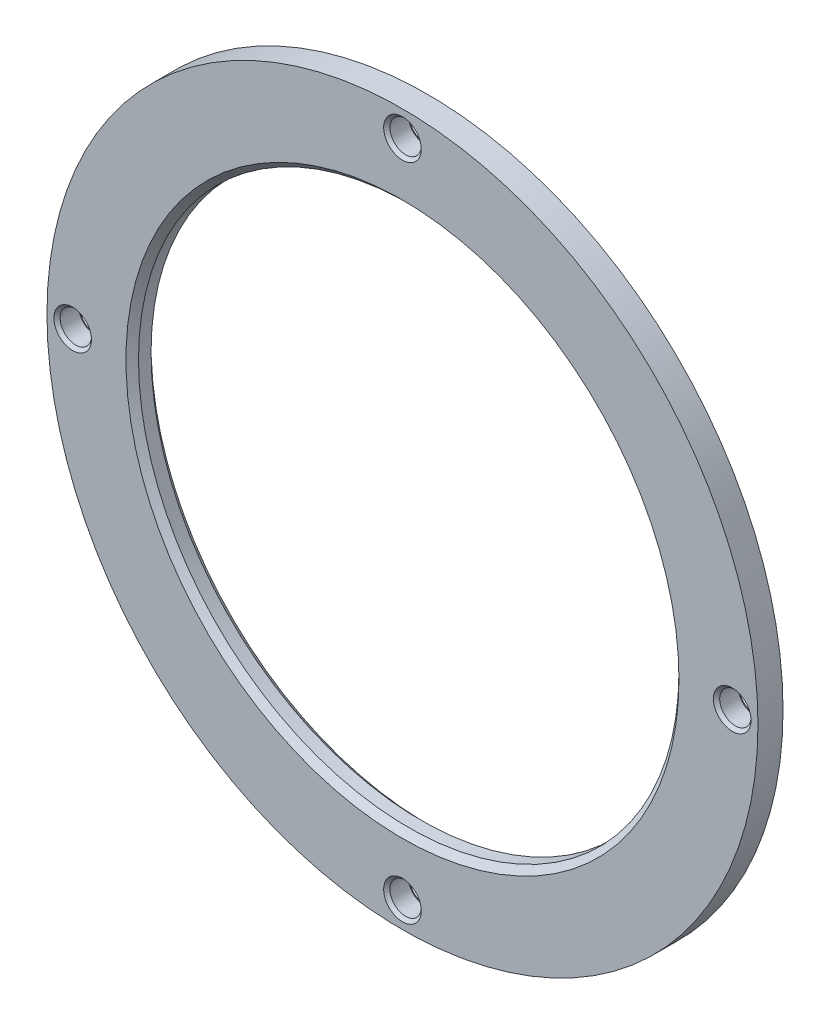
ISO-10303-21;
HEADER;
FILE_DESCRIPTION(('STEP AP214'),'2;1');
FILE_NAME('part.step','',(''),(''),'','','');
FILE_SCHEMA(('AUTOMOTIVE_DESIGN { 1 0 10303 214 1 1 1 1 }'));
ENDSEC;
DATA;
#1=APPLICATION_CONTEXT('core data for automotive mechanical design processes');
#2=APPLICATION_PROTOCOL_DEFINITION('international standard','automotive_design',2000,#1);
#3=PRODUCT_CONTEXT('',#1,'mechanical');
#4=PRODUCT('Part','Part','',(#3));
#5=PRODUCT_RELATED_PRODUCT_CATEGORY('part','',(#4));
#6=PRODUCT_DEFINITION_FORMATION('','',#4);
#7=PRODUCT_DEFINITION_CONTEXT('part definition',#1,'design');
#8=PRODUCT_DEFINITION('design','',#6,#7);
#9=PRODUCT_DEFINITION_SHAPE('','',#8);
#10=(LENGTH_UNIT() NAMED_UNIT(*) SI_UNIT(.MILLI.,.METRE.));
#11=(NAMED_UNIT(*) PLANE_ANGLE_UNIT() SI_UNIT($,.RADIAN.));
#12=(NAMED_UNIT(*) SI_UNIT($,.STERADIAN.) SOLID_ANGLE_UNIT());
#13=UNCERTAINTY_MEASURE_WITH_UNIT(LENGTH_MEASURE(1.E-05),#10,'distance_accuracy_value','');
#14=(GEOMETRIC_REPRESENTATION_CONTEXT(3) GLOBAL_UNCERTAINTY_ASSIGNED_CONTEXT((#13)) GLOBAL_UNIT_ASSIGNED_CONTEXT((#10,
#11,#12)) REPRESENTATION_CONTEXT('',''));
#15=CARTESIAN_POINT('',(0.,0.,0.));
#16=DIRECTION('',(0.,0.,1.));
#17=DIRECTION('',(1.,0.,0.));
#18=AXIS2_PLACEMENT_3D('',#15,#16,#17);
#19=CARTESIAN_POINT('',(0.,0.,2.));
#20=DIRECTION('',(0.,0.,1.));
#21=DIRECTION('',(1.,0.,0.));
#22=AXIS2_PLACEMENT_3D('',#19,#20,#21);
#23=PLANE('',#22);
#24=CARTESIAN_POINT('',(-2.75477877634723E-13,-26.3,2.));
#25=DIRECTION('',(0.,0.,1.));
#26=DIRECTION('',(1.,0.,0.));
#27=AXIS2_PLACEMENT_3D('',#24,#25,#26);
#28=CIRCLE('',#27,1.49999999999999);
#29=CARTESIAN_POINT('',(1.49999999999972,-26.3,2.));
#30=VERTEX_POINT('',#29);
#31=EDGE_CURVE('E11',#30,#30,#28,.F.);
#32=ORIENTED_EDGE('',*,*,#31,.T.);
#33=EDGE_LOOP('',(#32));
#34=FACE_BOUND('',#33,.T.);
#35=CARTESIAN_POINT('',(26.3,0.,2.));
#36=DIRECTION('',(0.,0.,1.));
#37=DIRECTION('',(1.,0.,0.));
#38=AXIS2_PLACEMENT_3D('',#35,#36,#37);
#39=CIRCLE('',#38,1.49999999999999);
#40=CARTESIAN_POINT('',(27.8,0.,2.));
#41=VERTEX_POINT('',#40);
#42=EDGE_CURVE('E59',#41,#41,#39,.F.);
#43=ORIENTED_EDGE('',*,*,#42,.T.);
#44=EDGE_LOOP('',(#43));
#45=FACE_BOUND('',#44,.T.);
#46=CARTESIAN_POINT('',(0.,26.3,2.));
#47=DIRECTION('',(0.,0.,1.));
#48=DIRECTION('',(1.,0.,0.));
#49=AXIS2_PLACEMENT_3D('',#46,#47,#48);
#50=CIRCLE('',#49,1.49999999999999);
#51=CARTESIAN_POINT('',(1.50000000000009,26.3,2.));
#52=VERTEX_POINT('',#51);
#53=EDGE_CURVE('E63',#52,#52,#50,.F.);
#54=ORIENTED_EDGE('',*,*,#53,.T.);
#55=EDGE_LOOP('',(#54));
#56=FACE_BOUND('',#55,.T.);
#57=CARTESIAN_POINT('',(-26.3,0.,2.));
#58=DIRECTION('',(0.,0.,1.));
#59=DIRECTION('',(1.,0.,0.));
#60=AXIS2_PLACEMENT_3D('',#57,#58,#59);
#61=CIRCLE('',#60,1.49999999999999);
#62=CARTESIAN_POINT('',(-24.8,0.,2.));
#63=VERTEX_POINT('',#62);
#64=EDGE_CURVE('E67',#63,#63,#61,.F.);
#65=ORIENTED_EDGE('',*,*,#64,.T.);
#66=EDGE_LOOP('',(#65));
#67=FACE_BOUND('',#66,.T.);
#68=CARTESIAN_POINT('',(0.,0.,2.));
#69=DIRECTION('',(0.,0.,1.));
#70=DIRECTION('',(1.,0.,0.));
#71=AXIS2_PLACEMENT_3D('',#68,#69,#70);
#72=CIRCLE('',#71,22.05);
#73=CARTESIAN_POINT('',(22.05,0.,2.));
#74=VERTEX_POINT('',#73);
#75=EDGE_CURVE('E111',#74,#74,#72,.F.);
#76=ORIENTED_EDGE('',*,*,#75,.T.);
#77=EDGE_LOOP('',(#76));
#78=FACE_BOUND('',#77,.T.);
#79=CARTESIAN_POINT('',(0.,0.,2.));
#80=DIRECTION('',(0.,0.,1.));
#81=DIRECTION('',(1.,0.,0.));
#82=AXIS2_PLACEMENT_3D('',#79,#80,#81);
#83=CIRCLE('',#82,28.35);
#84=CARTESIAN_POINT('',(28.35,0.,2.));
#85=VERTEX_POINT('',#84);
#86=EDGE_CURVE('E120',#85,#85,#83,.T.);
#87=ORIENTED_EDGE('',*,*,#86,.T.);
#88=EDGE_LOOP('',(#87));
#89=FACE_BOUND('',#88,.T.);
#90=ADVANCED_FACE('F51',(#34,#45,#56,#67,#78,#89),#23,.T.);
#91=CARTESIAN_POINT('',(0.,0.,0.));
#92=DIRECTION('',(0.,0.,1.));
#93=DIRECTION('',(1.,0.,0.));
#94=AXIS2_PLACEMENT_3D('',#91,#92,#93);
#95=PLANE('',#94);
#96=CARTESIAN_POINT('',(-26.3,0.,0.));
#97=DIRECTION('',(0.,0.,1.));
#98=DIRECTION('',(1.,0.,0.));
#99=AXIS2_PLACEMENT_3D('',#96,#97,#98);
#100=CIRCLE('',#99,1.49999999999999);
#101=CARTESIAN_POINT('',(-24.8,0.,0.));
#102=VERTEX_POINT('',#101);
#103=EDGE_CURVE('E96',#102,#102,#100,.T.);
#104=ORIENTED_EDGE('',*,*,#103,.T.);
#105=EDGE_LOOP('',(#104));
#106=FACE_BOUND('',#105,.T.);
#107=CARTESIAN_POINT('',(0.,26.3,0.));
#108=DIRECTION('',(0.,0.,1.));
#109=DIRECTION('',(1.,0.,0.));
#110=AXIS2_PLACEMENT_3D('',#107,#108,#109);
#111=CIRCLE('',#110,1.49999999999999);
#112=CARTESIAN_POINT('',(1.50000000000009,26.3,0.));
#113=VERTEX_POINT('',#112);
#114=EDGE_CURVE('E99',#113,#113,#111,.T.);
#115=ORIENTED_EDGE('',*,*,#114,.T.);
#116=EDGE_LOOP('',(#115));
#117=FACE_BOUND('',#116,.T.);
#118=CARTESIAN_POINT('',(26.3,0.,0.));
#119=DIRECTION('',(0.,0.,1.));
#120=DIRECTION('',(1.,0.,0.));
#121=AXIS2_PLACEMENT_3D('',#118,#119,#120);
#122=CIRCLE('',#121,1.49999999999999);
#123=CARTESIAN_POINT('',(27.8,0.,0.));
#124=VERTEX_POINT('',#123);
#125=EDGE_CURVE('E102',#124,#124,#122,.T.);
#126=ORIENTED_EDGE('',*,*,#125,.T.);
#127=EDGE_LOOP('',(#126));
#128=FACE_BOUND('',#127,.T.);
#129=CARTESIAN_POINT('',(-2.75477877634723E-13,-26.3,0.));
#130=DIRECTION('',(0.,0.,1.));
#131=DIRECTION('',(1.,0.,0.));
#132=AXIS2_PLACEMENT_3D('',#129,#130,#131);
#133=CIRCLE('',#132,1.49999999999999);
#134=CARTESIAN_POINT('',(1.49999999999972,-26.3,0.));
#135=VERTEX_POINT('',#134);
#136=EDGE_CURVE('E105',#135,#135,#133,.T.);
#137=ORIENTED_EDGE('',*,*,#136,.T.);
#138=EDGE_LOOP('',(#137));
#139=FACE_BOUND('',#138,.T.);
#140=CARTESIAN_POINT('',(0.,0.,0.));
#141=DIRECTION('',(0.,0.,1.));
#142=DIRECTION('',(1.,0.,0.));
#143=AXIS2_PLACEMENT_3D('',#140,#141,#142);
#144=CIRCLE('',#143,22.05);
#145=CARTESIAN_POINT('',(22.05,0.,0.));
#146=VERTEX_POINT('',#145);
#147=EDGE_CURVE('E108',#146,#146,#144,.T.);
#148=ORIENTED_EDGE('',*,*,#147,.T.);
#149=EDGE_LOOP('',(#148));
#150=FACE_BOUND('',#149,.T.);
#151=CARTESIAN_POINT('',(0.,0.,0.));
#152=DIRECTION('',(0.,0.,1.));
#153=DIRECTION('',(1.,0.,0.));
#154=AXIS2_PLACEMENT_3D('',#151,#152,#153);
#155=CIRCLE('',#154,28.35);
#156=CARTESIAN_POINT('',(28.35,0.,0.));
#157=VERTEX_POINT('',#156);
#158=EDGE_CURVE('E121',#157,#157,#155,.T.);
#159=ORIENTED_EDGE('',*,*,#158,.F.);
#160=EDGE_LOOP('',(#159));
#161=FACE_BOUND('',#160,.T.);
#162=ADVANCED_FACE('F132',(#106,#117,#128,#139,#150,#161),#95,.F.);
#163=CARTESIAN_POINT('',(0.,0.,2.));
#164=DIRECTION('',(0.,0.,-1.));
#165=DIRECTION('',(-1.,0.,0.));
#166=AXIS2_PLACEMENT_3D('',#163,#164,#165);
#167=CYLINDRICAL_SURFACE('',#166,28.35);
#168=ORIENTED_EDGE('',*,*,#86,.F.);
#169=EDGE_LOOP('',(#168));
#170=FACE_BOUND('',#169,.T.);
#171=ORIENTED_EDGE('',*,*,#158,.T.);
#172=EDGE_LOOP('',(#171));
#173=FACE_BOUND('',#172,.T.);
#174=ADVANCED_FACE('F128',(#170,#173),#167,.T.);
#175=CARTESIAN_POINT('',(0.,0.,2.));
#176=DIRECTION('',(0.,0.,-1.));
#177=DIRECTION('',(-1.,0.,0.));
#178=AXIS2_PLACEMENT_3D('',#175,#176,#177);
#179=CYLINDRICAL_SURFACE('',#178,21.55);
#180=CARTESIAN_POINT('',(0.,0.,1.5));
#181=DIRECTION('',(0.,0.,1.));
#182=DIRECTION('',(1.,0.,0.));
#183=AXIS2_PLACEMENT_3D('',#180,#181,#182);
#184=CIRCLE('',#183,21.55);
#185=CARTESIAN_POINT('',(21.55,0.,1.5));
#186=VERTEX_POINT('',#185);
#187=EDGE_CURVE('E114',#186,#186,#184,.T.);
#188=ORIENTED_EDGE('',*,*,#187,.T.);
#189=EDGE_LOOP('',(#188));
#190=FACE_BOUND('',#189,.T.);
#191=CARTESIAN_POINT('',(0.,0.,0.500000000000014));
#192=DIRECTION('',(0.,0.,1.));
#193=DIRECTION('',(1.,0.,0.));
#194=AXIS2_PLACEMENT_3D('',#191,#192,#193);
#195=CIRCLE('',#194,21.55);
#196=CARTESIAN_POINT('',(21.55,0.,0.500000000000014));
#197=VERTEX_POINT('',#196);
#198=EDGE_CURVE('E117',#197,#197,#195,.F.);
#199=ORIENTED_EDGE('',*,*,#198,.T.);
#200=EDGE_LOOP('',(#199));
#201=FACE_BOUND('',#200,.T.);
#202=ADVANCED_FACE('F131',(#190,#201),#179,.F.);
#203=CARTESIAN_POINT('',(0.,0.,1.5));
#204=DIRECTION('',(0.,0.,1.));
#205=DIRECTION('',(1.,0.,0.));
#206=AXIS2_PLACEMENT_3D('',#203,#204,#205);
#207=CONICAL_SURFACE('',#206,21.55,0.785398163397459);
#208=ORIENTED_EDGE('',*,*,#75,.F.);
#209=EDGE_LOOP('',(#208));
#210=FACE_BOUND('',#209,.T.);
#211=ORIENTED_EDGE('',*,*,#187,.F.);
#212=EDGE_LOOP('',(#211));
#213=FACE_BOUND('',#212,.T.);
#214=ADVANCED_FACE('F148',(#210,#213),#207,.F.);
#215=CARTESIAN_POINT('',(0.,0.,0.));
#216=DIRECTION('',(0.,0.,-1.));
#217=DIRECTION('',(-1.,0.,0.));
#218=AXIS2_PLACEMENT_3D('',#215,#216,#217);
#219=CONICAL_SURFACE('',#218,22.05,0.785398163397435);
#220=ORIENTED_EDGE('',*,*,#198,.F.);
#221=EDGE_LOOP('',(#220));
#222=FACE_BOUND('',#221,.T.);
#223=ORIENTED_EDGE('',*,*,#147,.F.);
#224=EDGE_LOOP('',(#223));
#225=FACE_BOUND('',#224,.T.);
#226=ADVANCED_FACE('F154',(#222,#225),#219,.F.);
#227=CARTESIAN_POINT('',(-26.3,0.,2.));
#228=DIRECTION('',(0.,0.,-1.));
#229=DIRECTION('',(-1.,0.,0.));
#230=AXIS2_PLACEMENT_3D('',#227,#228,#229);
#231=CYLINDRICAL_SURFACE('',#230,1.25);
#232=CARTESIAN_POINT('',(-26.3,0.,0.249999999999997));
#233=DIRECTION('',(0.,0.,1.));
#234=DIRECTION('',(1.,0.,0.));
#235=AXIS2_PLACEMENT_3D('',#232,#233,#234);
#236=CIRCLE('',#235,1.25);
#237=CARTESIAN_POINT('',(-25.05,0.,0.249999999999997));
#238=VERTEX_POINT('',#237);
#239=EDGE_CURVE('E90',#238,#238,#236,.F.);
#240=ORIENTED_EDGE('',*,*,#239,.T.);
#241=EDGE_LOOP('',(#240));
#242=FACE_BOUND('',#241,.T.);
#243=CARTESIAN_POINT('',(-26.3,0.,1.75));
#244=DIRECTION('',(0.,0.,1.));
#245=DIRECTION('',(1.,0.,0.));
#246=AXIS2_PLACEMENT_3D('',#243,#244,#245);
#247=CIRCLE('',#246,1.25);
#248=CARTESIAN_POINT('',(-25.05,0.,1.75));
#249=VERTEX_POINT('',#248);
#250=EDGE_CURVE('E93',#249,#249,#247,.T.);
#251=ORIENTED_EDGE('',*,*,#250,.T.);
#252=EDGE_LOOP('',(#251));
#253=FACE_BOUND('',#252,.T.);
#254=ADVANCED_FACE('F161',(#242,#253),#231,.F.);
#255=CARTESIAN_POINT('',(-2.75477877634723E-13,-26.3,2.));
#256=DIRECTION('',(0.,0.,-1.));
#257=DIRECTION('',(-1.,0.,0.));
#258=AXIS2_PLACEMENT_3D('',#255,#256,#257);
#259=CYLINDRICAL_SURFACE('',#258,1.25);
#260=CARTESIAN_POINT('',(-2.75477877634723E-13,-26.3,0.249999999999997));
#261=DIRECTION('',(0.,0.,1.));
#262=DIRECTION('',(1.,0.,0.));
#263=AXIS2_PLACEMENT_3D('',#260,#261,#262);
#264=CIRCLE('',#263,1.25);
#265=CARTESIAN_POINT('',(1.24999999999973,-26.3,0.249999999999997));
#266=VERTEX_POINT('',#265);
#267=EDGE_CURVE('E72',#266,#266,#264,.F.);
#268=ORIENTED_EDGE('',*,*,#267,.T.);
#269=EDGE_LOOP('',(#268));
#270=FACE_BOUND('',#269,.T.);
#271=CARTESIAN_POINT('',(-2.75477877634723E-13,-26.3,1.75));
#272=DIRECTION('',(0.,0.,1.));
#273=DIRECTION('',(1.,0.,0.));
#274=AXIS2_PLACEMENT_3D('',#271,#272,#273);
#275=CIRCLE('',#274,1.25);
#276=CARTESIAN_POINT('',(1.24999999999973,-26.3,1.75));
#277=VERTEX_POINT('',#276);
#278=EDGE_CURVE('E75',#277,#277,#275,.T.);
#279=ORIENTED_EDGE('',*,*,#278,.T.);
#280=EDGE_LOOP('',(#279));
#281=FACE_BOUND('',#280,.T.);
#282=ADVANCED_FACE('F225',(#270,#281),#259,.F.);
#283=CARTESIAN_POINT('',(26.3,0.,2.));
#284=DIRECTION('',(0.,0.,-1.));
#285=DIRECTION('',(-1.,0.,0.));
#286=AXIS2_PLACEMENT_3D('',#283,#284,#285);
#287=CYLINDRICAL_SURFACE('',#286,1.25);
#288=CARTESIAN_POINT('',(26.3,0.,0.249999999999997));
#289=DIRECTION('',(0.,0.,1.));
#290=DIRECTION('',(1.,0.,0.));
#291=AXIS2_PLACEMENT_3D('',#288,#289,#290);
#292=CIRCLE('',#291,1.25);
#293=CARTESIAN_POINT('',(27.55,0.,0.249999999999997));
#294=VERTEX_POINT('',#293);
#295=EDGE_CURVE('E78',#294,#294,#292,.F.);
#296=ORIENTED_EDGE('',*,*,#295,.T.);
#297=EDGE_LOOP('',(#296));
#298=FACE_BOUND('',#297,.T.);
#299=CARTESIAN_POINT('',(26.3,0.,1.75));
#300=DIRECTION('',(0.,0.,1.));
#301=DIRECTION('',(1.,0.,0.));
#302=AXIS2_PLACEMENT_3D('',#299,#300,#301);
#303=CIRCLE('',#302,1.25);
#304=CARTESIAN_POINT('',(27.55,0.,1.75));
#305=VERTEX_POINT('',#304);
#306=EDGE_CURVE('E81',#305,#305,#303,.T.);
#307=ORIENTED_EDGE('',*,*,#306,.T.);
#308=EDGE_LOOP('',(#307));
#309=FACE_BOUND('',#308,.T.);
#310=ADVANCED_FACE('F219',(#298,#309),#287,.F.);
#311=CARTESIAN_POINT('',(0.,26.3,2.));
#312=DIRECTION('',(0.,0.,-1.));
#313=DIRECTION('',(-1.,0.,0.));
#314=AXIS2_PLACEMENT_3D('',#311,#312,#313);
#315=CYLINDRICAL_SURFACE('',#314,1.25);
#316=CARTESIAN_POINT('',(0.,26.3,0.249999999999997));
#317=DIRECTION('',(0.,0.,1.));
#318=DIRECTION('',(1.,0.,0.));
#319=AXIS2_PLACEMENT_3D('',#316,#317,#318);
#320=CIRCLE('',#319,1.25);
#321=CARTESIAN_POINT('',(1.25000000000009,26.3,0.249999999999997));
#322=VERTEX_POINT('',#321);
#323=EDGE_CURVE('E84',#322,#322,#320,.F.);
#324=ORIENTED_EDGE('',*,*,#323,.T.);
#325=EDGE_LOOP('',(#324));
#326=FACE_BOUND('',#325,.T.);
#327=CARTESIAN_POINT('',(0.,26.3,1.75));
#328=DIRECTION('',(0.,0.,1.));
#329=DIRECTION('',(1.,0.,0.));
#330=AXIS2_PLACEMENT_3D('',#327,#328,#329);
#331=CIRCLE('',#330,1.25);
#332=CARTESIAN_POINT('',(1.25000000000009,26.3,1.75));
#333=VERTEX_POINT('',#332);
#334=EDGE_CURVE('E87',#333,#333,#331,.T.);
#335=ORIENTED_EDGE('',*,*,#334,.T.);
#336=EDGE_LOOP('',(#335));
#337=FACE_BOUND('',#336,.T.);
#338=ADVANCED_FACE('F170',(#326,#337),#315,.F.);
#339=CARTESIAN_POINT('',(-26.3,0.,0.));
#340=DIRECTION('',(0.,0.,-1.));
#341=DIRECTION('',(-1.,0.,0.));
#342=AXIS2_PLACEMENT_3D('',#339,#340,#341);
#343=CONICAL_SURFACE('',#342,1.49999999999999,0.78539816339744);
#344=ORIENTED_EDGE('',*,*,#239,.F.);
#345=EDGE_LOOP('',(#344));
#346=FACE_BOUND('',#345,.T.);
#347=ORIENTED_EDGE('',*,*,#103,.F.);
#348=EDGE_LOOP('',(#347));
#349=FACE_BOUND('',#348,.T.);
#350=ADVANCED_FACE('F163',(#346,#349),#343,.F.);
#351=CARTESIAN_POINT('',(0.,26.3,0.));
#352=DIRECTION('',(0.,0.,-1.));
#353=DIRECTION('',(-1.,0.,0.));
#354=AXIS2_PLACEMENT_3D('',#351,#352,#353);
#355=CONICAL_SURFACE('',#354,1.49999999999999,0.78539816339744);
#356=ORIENTED_EDGE('',*,*,#323,.F.);
#357=EDGE_LOOP('',(#356));
#358=FACE_BOUND('',#357,.T.);
#359=ORIENTED_EDGE('',*,*,#114,.F.);
#360=EDGE_LOOP('',(#359));
#361=FACE_BOUND('',#360,.T.);
#362=ADVANCED_FACE('F169',(#358,#361),#355,.F.);
#363=CARTESIAN_POINT('',(26.3,0.,0.));
#364=DIRECTION('',(0.,0.,-1.));
#365=DIRECTION('',(-1.,0.,0.));
#366=AXIS2_PLACEMENT_3D('',#363,#364,#365);
#367=CONICAL_SURFACE('',#366,1.49999999999999,0.78539816339744);
#368=ORIENTED_EDGE('',*,*,#295,.F.);
#369=EDGE_LOOP('',(#368));
#370=FACE_BOUND('',#369,.T.);
#371=ORIENTED_EDGE('',*,*,#125,.F.);
#372=EDGE_LOOP('',(#371));
#373=FACE_BOUND('',#372,.T.);
#374=ADVANCED_FACE('F177',(#370,#373),#367,.F.);
#375=CARTESIAN_POINT('',(-2.75477877634723E-13,-26.3,0.));
#376=DIRECTION('',(0.,0.,-1.));
#377=DIRECTION('',(-1.,0.,0.));
#378=AXIS2_PLACEMENT_3D('',#375,#376,#377);
#379=CONICAL_SURFACE('',#378,1.49999999999999,0.78539816339744);
#380=ORIENTED_EDGE('',*,*,#267,.F.);
#381=EDGE_LOOP('',(#380));
#382=FACE_BOUND('',#381,.T.);
#383=ORIENTED_EDGE('',*,*,#136,.F.);
#384=EDGE_LOOP('',(#383));
#385=FACE_BOUND('',#384,.T.);
#386=ADVANCED_FACE('F184',(#382,#385),#379,.F.);
#387=CARTESIAN_POINT('',(-2.75477877634723E-13,-26.3,1.75));
#388=DIRECTION('',(0.,0.,1.));
#389=DIRECTION('',(1.,0.,0.));
#390=AXIS2_PLACEMENT_3D('',#387,#388,#389);
#391=CONICAL_SURFACE('',#390,1.25,0.78539816339744);
#392=ORIENTED_EDGE('',*,*,#31,.F.);
#393=EDGE_LOOP('',(#392));
#394=FACE_BOUND('',#393,.T.);
#395=ORIENTED_EDGE('',*,*,#278,.F.);
#396=EDGE_LOOP('',(#395));
#397=FACE_BOUND('',#396,.T.);
#398=ADVANCED_FACE('F191',(#394,#397),#391,.F.);
#399=CARTESIAN_POINT('',(26.3,0.,1.75));
#400=DIRECTION('',(0.,0.,1.));
#401=DIRECTION('',(1.,0.,0.));
#402=AXIS2_PLACEMENT_3D('',#399,#400,#401);
#403=CONICAL_SURFACE('',#402,1.25,0.78539816339744);
#404=ORIENTED_EDGE('',*,*,#42,.F.);
#405=EDGE_LOOP('',(#404));
#406=FACE_BOUND('',#405,.T.);
#407=ORIENTED_EDGE('',*,*,#306,.F.);
#408=EDGE_LOOP('',(#407));
#409=FACE_BOUND('',#408,.T.);
#410=ADVANCED_FACE('F198',(#406,#409),#403,.F.);
#411=CARTESIAN_POINT('',(0.,26.3,1.75));
#412=DIRECTION('',(0.,0.,1.));
#413=DIRECTION('',(1.,0.,0.));
#414=AXIS2_PLACEMENT_3D('',#411,#412,#413);
#415=CONICAL_SURFACE('',#414,1.25,0.78539816339744);
#416=ORIENTED_EDGE('',*,*,#53,.F.);
#417=EDGE_LOOP('',(#416));
#418=FACE_BOUND('',#417,.T.);
#419=ORIENTED_EDGE('',*,*,#334,.F.);
#420=EDGE_LOOP('',(#419));
#421=FACE_BOUND('',#420,.T.);
#422=ADVANCED_FACE('F204',(#418,#421),#415,.F.);
#423=CARTESIAN_POINT('',(-26.3,0.,1.75));
#424=DIRECTION('',(0.,0.,1.));
#425=DIRECTION('',(1.,0.,0.));
#426=AXIS2_PLACEMENT_3D('',#423,#424,#425);
#427=CONICAL_SURFACE('',#426,1.25,0.78539816339744);
#428=ORIENTED_EDGE('',*,*,#64,.F.);
#429=EDGE_LOOP('',(#428));
#430=FACE_BOUND('',#429,.T.);
#431=ORIENTED_EDGE('',*,*,#250,.F.);
#432=EDGE_LOOP('',(#431));
#433=FACE_BOUND('',#432,.T.);
#434=ADVANCED_FACE('F54',(#430,#433),#427,.F.);
#435=CLOSED_SHELL('',(#90,#162,#174,#202,#214,#226,#254,#282,#310,#338,#350,#362,#374,#386,#398,
#410,#422,#434));
#436=MANIFOLD_SOLID_BREP('B2',#435);
#437=ADVANCED_BREP_SHAPE_REPRESENTATION('',(#18,#436),#14);
#438=SHAPE_DEFINITION_REPRESENTATION(#9,#437);
ENDSEC;
END-ISO-10303-21;
